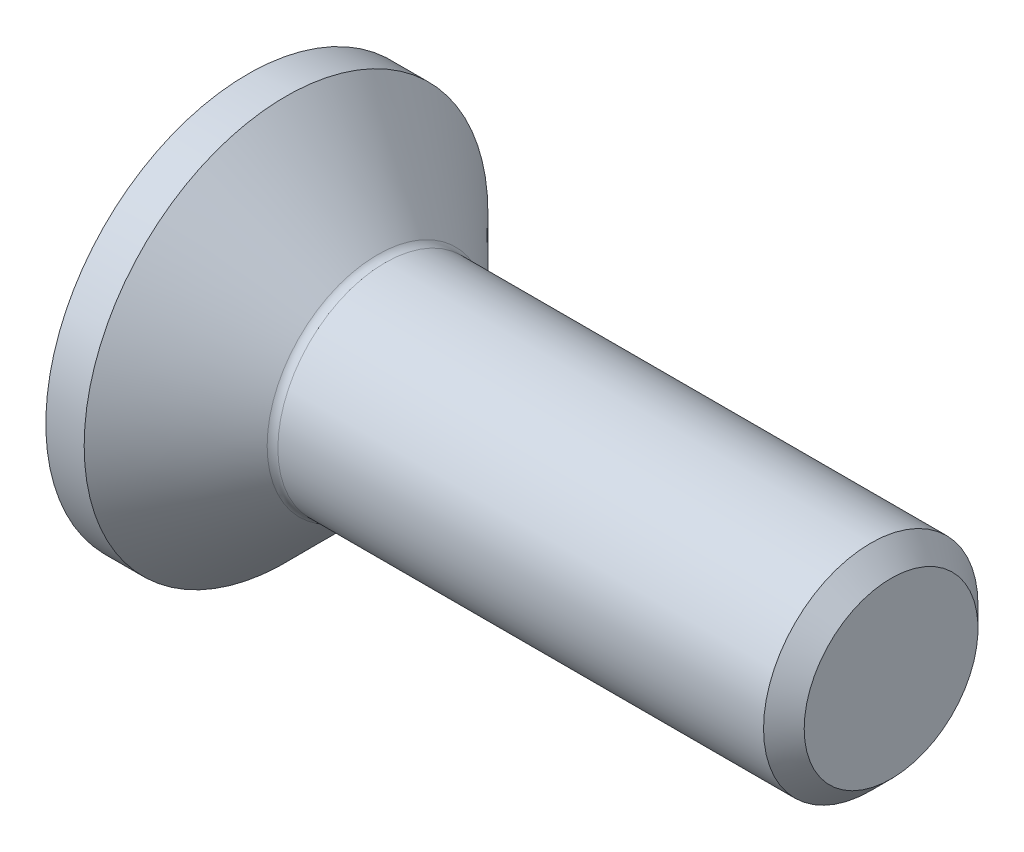
ISO-10303-21;
HEADER;
FILE_DESCRIPTION(('STEP AP214'),'2;1');
FILE_NAME('part.step','',(''),(''),'','','');
FILE_SCHEMA(('AUTOMOTIVE_DESIGN { 1 0 10303 214 1 1 1 1 }'));
ENDSEC;
DATA;
#1=APPLICATION_CONTEXT('core data for automotive mechanical design processes');
#2=APPLICATION_PROTOCOL_DEFINITION('international standard','automotive_design',2000,#1);
#3=PRODUCT_CONTEXT('',#1,'mechanical');
#4=PRODUCT('Part','Part','',(#3));
#5=PRODUCT_RELATED_PRODUCT_CATEGORY('part','',(#4));
#6=PRODUCT_DEFINITION_FORMATION('','',#4);
#7=PRODUCT_DEFINITION_CONTEXT('part definition',#1,'design');
#8=PRODUCT_DEFINITION('design','',#6,#7);
#9=PRODUCT_DEFINITION_SHAPE('','',#8);
#10=(LENGTH_UNIT() NAMED_UNIT(*) SI_UNIT(.MILLI.,.METRE.));
#11=(NAMED_UNIT(*) PLANE_ANGLE_UNIT() SI_UNIT($,.RADIAN.));
#12=(NAMED_UNIT(*) SI_UNIT($,.STERADIAN.) SOLID_ANGLE_UNIT());
#13=UNCERTAINTY_MEASURE_WITH_UNIT(LENGTH_MEASURE(1.E-05),#10,'distance_accuracy_value','');
#14=(GEOMETRIC_REPRESENTATION_CONTEXT(3) GLOBAL_UNCERTAINTY_ASSIGNED_CONTEXT((#13)) GLOBAL_UNIT_ASSIGNED_CONTEXT((#10,
#11,#12)) REPRESENTATION_CONTEXT('',''));
#15=CARTESIAN_POINT('',(0.,0.,0.));
#16=DIRECTION('',(0.,0.,1.));
#17=DIRECTION('',(1.,0.,0.));
#18=AXIS2_PLACEMENT_3D('',#15,#16,#17);
#19=CARTESIAN_POINT('',(12.,2.,0.));
#20=DIRECTION('',(-1.,0.,0.));
#21=DIRECTION('',(0.,0.,1.));
#22=AXIS2_PLACEMENT_3D('',#19,#20,#21);
#23=PLANE('',#22);
#24=CARTESIAN_POINT('',(12.,0.,0.));
#25=DIRECTION('',(-1.,0.,0.));
#26=DIRECTION('',(0.,0.,1.));
#27=AXIS2_PLACEMENT_3D('',#24,#25,#26);
#28=CIRCLE('',#27,1.62099999999999);
#29=CARTESIAN_POINT('',(12.,0.,1.62099999999999));
#30=VERTEX_POINT('',#29);
#31=EDGE_CURVE('E11',#30,#30,#28,.F.);
#32=ORIENTED_EDGE('',*,*,#31,.T.);
#33=EDGE_LOOP('',(#32));
#34=FACE_BOUND('',#33,.T.);
#35=ADVANCED_FACE('F36',(#34),#23,.F.);
#36=CARTESIAN_POINT('',(-0.587069180985524,0.,0.));
#37=DIRECTION('',(-1.,0.,0.));
#38=DIRECTION('',(0.,0.,1.));
#39=AXIS2_PLACEMENT_3D('',#36,#37,#38);
#40=CYLINDRICAL_SURFACE('',#39,2.);
#41=CARTESIAN_POINT('',(11.621,0.,0.));
#42=DIRECTION('',(-1.,0.,0.));
#43=DIRECTION('',(0.,0.,1.));
#44=AXIS2_PLACEMENT_3D('',#41,#42,#43);
#45=CIRCLE('',#44,2.);
#46=CARTESIAN_POINT('',(11.621,0.,2.));
#47=VERTEX_POINT('',#46);
#48=EDGE_CURVE('E45',#47,#47,#45,.T.);
#49=ORIENTED_EDGE('',*,*,#48,.T.);
#50=EDGE_LOOP('',(#49));
#51=FACE_BOUND('',#50,.T.);
#52=CARTESIAN_POINT('',(2.56284271247462,0.,0.));
#53=DIRECTION('',(-1.,0.,0.));
#54=DIRECTION('',(0.,0.,1.));
#55=AXIS2_PLACEMENT_3D('',#52,#53,#54);
#56=CIRCLE('',#55,2.);
#57=CARTESIAN_POINT('',(2.56284271247462,0.,2.));
#58=VERTEX_POINT('',#57);
#59=EDGE_CURVE('E149',#58,#58,#56,.F.);
#60=ORIENTED_EDGE('',*,*,#59,.T.);
#61=EDGE_LOOP('',(#60));
#62=FACE_BOUND('',#61,.T.);
#63=ADVANCED_FACE('F127',(#51,#62),#40,.T.);
#64=CARTESIAN_POINT('',(2.48,0.,0.));
#65=DIRECTION('',(-1.,0.,0.));
#66=DIRECTION('',(0.,0.,1.));
#67=AXIS2_PLACEMENT_3D('',#64,#65,#66);
#68=CONICAL_SURFACE('',#67,2.,0.785398163397448);
#69=CARTESIAN_POINT('',(0.714999999999996,0.,0.));
#70=DIRECTION('',(-1.,0.,0.));
#71=DIRECTION('',(0.,0.,1.));
#72=AXIS2_PLACEMENT_3D('',#69,#70,#71);
#73=CIRCLE('',#72,3.765);
#74=CARTESIAN_POINT('',(0.714999999999996,0.,3.765));
#75=VERTEX_POINT('',#74);
#76=EDGE_CURVE('E40',#75,#75,#73,.F.);
#77=ORIENTED_EDGE('',*,*,#76,.T.);
#78=EDGE_LOOP('',(#77));
#79=FACE_BOUND('',#78,.T.);
#80=CARTESIAN_POINT('',(2.42142135623731,0.,0.));
#81=DIRECTION('',(-1.,0.,0.));
#82=DIRECTION('',(0.,0.,1.));
#83=AXIS2_PLACEMENT_3D('',#80,#81,#82);
#84=CIRCLE('',#83,2.05857864376269);
#85=CARTESIAN_POINT('',(2.42142135623731,0.,2.05857864376269));
#86=VERTEX_POINT('',#85);
#87=EDGE_CURVE('E152',#86,#86,#84,.T.);
#88=ORIENTED_EDGE('',*,*,#87,.T.);
#89=EDGE_LOOP('',(#88));
#90=FACE_BOUND('',#89,.T.);
#91=ADVANCED_FACE('F133',(#79,#90),#68,.T.);
#92=CARTESIAN_POINT('',(2.56284271247462,0.,0.));
#93=DIRECTION('',(-1.,0.,0.));
#94=DIRECTION('',(0.,0.,1.));
#95=AXIS2_PLACEMENT_3D('',#92,#93,#94);
#96=TOROIDAL_SURFACE('',#95,2.2,0.2);
#97=ORIENTED_EDGE('',*,*,#59,.F.);
#98=EDGE_LOOP('',(#97));
#99=FACE_BOUND('',#98,.T.);
#100=ORIENTED_EDGE('',*,*,#87,.F.);
#101=EDGE_LOOP('',(#100));
#102=FACE_BOUND('',#101,.T.);
#103=ADVANCED_FACE('F137',(#99,#102),#96,.F.);
#104=CARTESIAN_POINT('',(11.621,0.,0.));
#105=DIRECTION('',(-1.,0.,0.));
#106=DIRECTION('',(0.,0.,1.));
#107=AXIS2_PLACEMENT_3D('',#104,#105,#106);
#108=CONICAL_SURFACE('',#107,2.,0.785398163397453);
#109=ORIENTED_EDGE('',*,*,#31,.F.);
#110=EDGE_LOOP('',(#109));
#111=FACE_BOUND('',#110,.T.);
#112=ORIENTED_EDGE('',*,*,#48,.F.);
#113=EDGE_LOOP('',(#112));
#114=FACE_BOUND('',#113,.T.);
#115=ADVANCED_FACE('F38',(#111,#114),#108,.T.);
#116=CARTESIAN_POINT('',(11.8531386861314,0.,0.));
#117=DIRECTION('',(1.,0.,0.));
#118=DIRECTION('',(0.,0.,-1.));
#119=AXIS2_PLACEMENT_3D('',#116,#117,#118);
#120=CYLINDRICAL_SURFACE('',#119,3.765);
#121=ORIENTED_EDGE('',*,*,#76,.F.);
#122=EDGE_LOOP('',(#121));
#123=FACE_BOUND('',#122,.T.);
#124=CARTESIAN_POINT('',(0.,0.,0.));
#125=DIRECTION('',(1.,0.,0.));
#126=DIRECTION('',(0.,0.,-1.));
#127=AXIS2_PLACEMENT_3D('',#124,#125,#126);
#128=CIRCLE('',#127,3.765);
#129=CARTESIAN_POINT('',(0.,0.,-3.765));
#130=VERTEX_POINT('',#129);
#131=EDGE_CURVE('E219',#130,#130,#128,.F.);
#132=ORIENTED_EDGE('',*,*,#131,.F.);
#133=EDGE_LOOP('',(#132));
#134=FACE_BOUND('',#133,.T.);
#135=ADVANCED_FACE('F114',(#123,#134),#120,.T.);
#136=CARTESIAN_POINT('',(2.22168783648703,0.,0.));
#137=DIRECTION('',(-1.,0.,0.));
#138=DIRECTION('',(0.,0.,1.));
#139=AXIS2_PLACEMENT_3D('',#136,#137,#138);
#140=CONICAL_SURFACE('',#139,0.,1.0471975511966);
#141=CARTESIAN_POINT('',(1.5,0.,0.));
#142=DIRECTION('',(-1.,0.,0.));
#143=DIRECTION('',(0.,0.,1.));
#144=AXIS2_PLACEMENT_3D('',#141,#142,#143);
#145=CIRCLE('',#144,1.25);
#146=CARTESIAN_POINT('',(1.5,0.625,1.08253175473055));
#147=VERTEX_POINT('',#146);
#148=CARTESIAN_POINT('',(1.5,1.25,0.));
#149=VERTEX_POINT('',#148);
#150=EDGE_CURVE('E159',#147,#149,#145,.T.);
#151=ORIENTED_EDGE('',*,*,#150,.T.);
#152=CARTESIAN_POINT('',(1.5,0.625000000000001,-1.08253175473055));
#153=VERTEX_POINT('',#152);
#154=EDGE_CURVE('E154',#149,#153,#145,.T.);
#155=ORIENTED_EDGE('',*,*,#154,.T.);
#156=CARTESIAN_POINT('',(1.5,-0.625,-1.08253175473055));
#157=VERTEX_POINT('',#156);
#158=EDGE_CURVE('E157',#153,#157,#145,.T.);
#159=ORIENTED_EDGE('',*,*,#158,.T.);
#160=CARTESIAN_POINT('',(1.5,-1.25,0.));
#161=VERTEX_POINT('',#160);
#162=EDGE_CURVE('E244',#157,#161,#145,.T.);
#163=ORIENTED_EDGE('',*,*,#162,.T.);
#164=CARTESIAN_POINT('',(1.5,-0.625,1.08253175473055));
#165=VERTEX_POINT('',#164);
#166=EDGE_CURVE('E52',#161,#165,#145,.T.);
#167=ORIENTED_EDGE('',*,*,#166,.T.);
#168=EDGE_CURVE('E168',#165,#147,#145,.T.);
#169=ORIENTED_EDGE('',*,*,#168,.T.);
#170=EDGE_LOOP('',(#151,#155,#159,#163,#167,#169));
#171=FACE_BOUND('',#170,.T.);
#172=CARTESIAN_POINT('',(2.22168783648703,0.,0.));
#173=VERTEX_POINT('',#172);
#174=VERTEX_LOOP('',#173);
#175=FACE_BOUND('',#174,.T.);
#176=ADVANCED_FACE('F111',(#171,#175),#140,.F.);
#177=CARTESIAN_POINT('',(1.5,0.,-1.44337567297407));
#178=DIRECTION('',(1.,0.,0.));
#179=DIRECTION('',(0.,0.,-1.));
#180=AXIS2_PLACEMENT_3D('',#177,#178,#179);
#181=PLANE('',#180);
#182=ORIENTED_EDGE('',*,*,#166,.F.);
#183=DIRECTION('',(0.,0.,-1.));
#184=VECTOR('',#183,1.);
#185=CARTESIAN_POINT('',(1.5,-1.25,0.721687836487032));
#186=LINE('',#185,#184);
#187=CARTESIAN_POINT('',(1.5,-1.25,0.721687836487032));
#188=VERTEX_POINT('',#187);
#189=EDGE_CURVE('E179',#188,#161,#186,.T.);
#190=ORIENTED_EDGE('',*,*,#189,.F.);
#191=DIRECTION('',(0.,-0.866025403784438,-0.5));
#192=VECTOR('',#191,1.);
#193=CARTESIAN_POINT('',(1.5,0.,1.44337567297406));
#194=LINE('',#193,#192);
#195=EDGE_CURVE('E203',#165,#188,#194,.T.);
#196=ORIENTED_EDGE('',*,*,#195,.F.);
#197=EDGE_LOOP('',(#182,#190,#196));
#198=FACE_BOUND('',#197,.T.);
#199=ADVANCED_FACE('F113',(#198),#181,.F.);
#200=ORIENTED_EDGE('',*,*,#168,.F.);
#201=CARTESIAN_POINT('',(1.5,0.,1.44337567297406));
#202=VERTEX_POINT('',#201);
#203=EDGE_CURVE('E200',#202,#165,#194,.T.);
#204=ORIENTED_EDGE('',*,*,#203,.F.);
#205=DIRECTION('',(0.,-0.866025403784439,0.5));
#206=VECTOR('',#205,1.);
#207=CARTESIAN_POINT('',(1.5,1.25,0.721687836487032));
#208=LINE('',#207,#206);
#209=EDGE_CURVE('E207',#147,#202,#208,.T.);
#210=ORIENTED_EDGE('',*,*,#209,.F.);
#211=EDGE_LOOP('',(#200,#204,#210));
#212=FACE_BOUND('',#211,.T.);
#213=ADVANCED_FACE('F120',(#212),#181,.F.);
#214=ORIENTED_EDGE('',*,*,#150,.F.);
#215=CARTESIAN_POINT('',(1.5,1.25,0.721687836487032));
#216=VERTEX_POINT('',#215);
#217=EDGE_CURVE('E204',#216,#147,#208,.T.);
#218=ORIENTED_EDGE('',*,*,#217,.F.);
#219=DIRECTION('',(0.,0.,1.));
#220=VECTOR('',#219,1.);
#221=CARTESIAN_POINT('',(1.5,1.25,-0.721687836487032));
#222=LINE('',#221,#220);
#223=EDGE_CURVE('E211',#149,#216,#222,.T.);
#224=ORIENTED_EDGE('',*,*,#223,.F.);
#225=EDGE_LOOP('',(#214,#218,#224));
#226=FACE_BOUND('',#225,.T.);
#227=ADVANCED_FACE('F275',(#226),#181,.F.);
#228=ORIENTED_EDGE('',*,*,#154,.F.);
#229=CARTESIAN_POINT('',(1.5,1.25,-0.721687836487032));
#230=VERTEX_POINT('',#229);
#231=EDGE_CURVE('E208',#230,#149,#222,.T.);
#232=ORIENTED_EDGE('',*,*,#231,.F.);
#233=DIRECTION('',(0.,0.866025403784438,0.5));
#234=VECTOR('',#233,1.);
#235=CARTESIAN_POINT('',(1.5,0.,-1.44337567297407));
#236=LINE('',#235,#234);
#237=EDGE_CURVE('E215',#153,#230,#236,.T.);
#238=ORIENTED_EDGE('',*,*,#237,.F.);
#239=EDGE_LOOP('',(#228,#232,#238));
#240=FACE_BOUND('',#239,.T.);
#241=ADVANCED_FACE('F280',(#240),#181,.F.);
#242=ORIENTED_EDGE('',*,*,#158,.F.);
#243=CARTESIAN_POINT('',(1.5,0.,-1.44337567297407));
#244=VERTEX_POINT('',#243);
#245=EDGE_CURVE('E212',#244,#153,#236,.T.);
#246=ORIENTED_EDGE('',*,*,#245,.F.);
#247=DIRECTION('',(0.,0.866025403784439,-0.5));
#248=VECTOR('',#247,1.);
#249=CARTESIAN_POINT('',(1.5,-1.25,-0.721687836487033));
#250=LINE('',#249,#248);
#251=EDGE_CURVE('E183',#157,#244,#250,.T.);
#252=ORIENTED_EDGE('',*,*,#251,.F.);
#253=EDGE_LOOP('',(#242,#246,#252));
#254=FACE_BOUND('',#253,.T.);
#255=ADVANCED_FACE('F249',(#254),#181,.F.);
#256=ORIENTED_EDGE('',*,*,#162,.F.);
#257=CARTESIAN_POINT('',(1.5,-1.25,-0.721687836487033));
#258=VERTEX_POINT('',#257);
#259=EDGE_CURVE('E216',#258,#157,#250,.T.);
#260=ORIENTED_EDGE('',*,*,#259,.F.);
#261=EDGE_CURVE('E199',#161,#258,#186,.T.);
#262=ORIENTED_EDGE('',*,*,#261,.F.);
#263=EDGE_LOOP('',(#256,#260,#262));
#264=FACE_BOUND('',#263,.T.);
#265=ADVANCED_FACE('F123',(#264),#181,.F.);
#266=CARTESIAN_POINT('',(1.5,-1.25,0.721687836487032));
#267=DIRECTION('',(0.,1.,0.));
#268=DIRECTION('',(0.,0.,1.));
#269=AXIS2_PLACEMENT_3D('',#266,#267,#268);
#270=PLANE('',#269);
#271=DIRECTION('',(0.,0.,-1.));
#272=VECTOR('',#271,1.);
#273=CARTESIAN_POINT('',(0.,-1.25,0.721687836487032));
#274=LINE('',#273,#272);
#275=CARTESIAN_POINT('',(0.,-1.25,0.721687836487032));
#276=VERTEX_POINT('',#275);
#277=CARTESIAN_POINT('',(0.,-1.25,-0.721687836487033));
#278=VERTEX_POINT('',#277);
#279=EDGE_CURVE('E180',#276,#278,#274,.T.);
#280=ORIENTED_EDGE('',*,*,#279,.F.);
#281=DIRECTION('',(-1.,0.,0.));
#282=VECTOR('',#281,1.);
#283=CARTESIAN_POINT('',(1.5,-1.25,0.721687836487032));
#284=LINE('',#283,#282);
#285=EDGE_CURVE('E175',#188,#276,#284,.T.);
#286=ORIENTED_EDGE('',*,*,#285,.F.);
#287=ORIENTED_EDGE('',*,*,#189,.T.);
#288=ORIENTED_EDGE('',*,*,#261,.T.);
#289=DIRECTION('',(-1.,0.,0.));
#290=VECTOR('',#289,1.);
#291=CARTESIAN_POINT('',(1.5,-1.25,-0.721687836487033));
#292=LINE('',#291,#290);
#293=EDGE_CURVE('E177',#258,#278,#292,.T.);
#294=ORIENTED_EDGE('',*,*,#293,.T.);
#295=EDGE_LOOP('',(#280,#286,#287,#288,#294));
#296=FACE_BOUND('',#295,.T.);
#297=ADVANCED_FACE('F238',(#296),#270,.T.);
#298=CARTESIAN_POINT('',(1.5,0.,1.44337567297406));
#299=DIRECTION('',(0.,0.5,-0.866025403784438));
#300=DIRECTION('',(0.,0.866025403784439,0.5));
#301=AXIS2_PLACEMENT_3D('',#298,#299,#300);
#302=PLANE('',#301);
#303=DIRECTION('',(0.,-0.866025403784438,-0.5));
#304=VECTOR('',#303,1.);
#305=CARTESIAN_POINT('',(0.,0.,1.44337567297406));
#306=LINE('',#305,#304);
#307=CARTESIAN_POINT('',(0.,0.,1.44337567297406));
#308=VERTEX_POINT('',#307);
#309=EDGE_CURVE('E184',#308,#276,#306,.T.);
#310=ORIENTED_EDGE('',*,*,#309,.F.);
#311=DIRECTION('',(-1.,0.,0.));
#312=VECTOR('',#311,1.);
#313=CARTESIAN_POINT('',(1.5,0.,1.44337567297406));
#314=LINE('',#313,#312);
#315=EDGE_CURVE('E173',#202,#308,#314,.T.);
#316=ORIENTED_EDGE('',*,*,#315,.F.);
#317=ORIENTED_EDGE('',*,*,#203,.T.);
#318=ORIENTED_EDGE('',*,*,#195,.T.);
#319=ORIENTED_EDGE('',*,*,#285,.T.);
#320=EDGE_LOOP('',(#310,#316,#317,#318,#319));
#321=FACE_BOUND('',#320,.T.);
#322=ADVANCED_FACE('F268',(#321),#302,.T.);
#323=CARTESIAN_POINT('',(1.5,1.25,0.721687836487032));
#324=DIRECTION('',(0.,-0.5,-0.866025403784438));
#325=DIRECTION('',(0.,0.866025403784439,-0.5));
#326=AXIS2_PLACEMENT_3D('',#323,#324,#325);
#327=PLANE('',#326);
#328=DIRECTION('',(0.,-0.866025403784439,0.5));
#329=VECTOR('',#328,1.);
#330=CARTESIAN_POINT('',(0.,1.25,0.721687836487032));
#331=LINE('',#330,#329);
#332=CARTESIAN_POINT('',(0.,1.25,0.721687836487032));
#333=VERTEX_POINT('',#332);
#334=EDGE_CURVE('E187',#333,#308,#331,.T.);
#335=ORIENTED_EDGE('',*,*,#334,.F.);
#336=DIRECTION('',(-1.,0.,0.));
#337=VECTOR('',#336,1.);
#338=CARTESIAN_POINT('',(1.5,1.25,0.721687836487032));
#339=LINE('',#338,#337);
#340=EDGE_CURVE('E171',#216,#333,#339,.T.);
#341=ORIENTED_EDGE('',*,*,#340,.F.);
#342=ORIENTED_EDGE('',*,*,#217,.T.);
#343=ORIENTED_EDGE('',*,*,#209,.T.);
#344=ORIENTED_EDGE('',*,*,#315,.T.);
#345=EDGE_LOOP('',(#335,#341,#342,#343,#344));
#346=FACE_BOUND('',#345,.T.);
#347=ADVANCED_FACE('F262',(#346),#327,.T.);
#348=CARTESIAN_POINT('',(1.5,1.25,-0.721687836487032));
#349=DIRECTION('',(0.,-1.,0.));
#350=DIRECTION('',(0.,0.,-1.));
#351=AXIS2_PLACEMENT_3D('',#348,#349,#350);
#352=PLANE('',#351);
#353=DIRECTION('',(0.,0.,1.));
#354=VECTOR('',#353,1.);
#355=CARTESIAN_POINT('',(0.,1.25,-0.721687836487032));
#356=LINE('',#355,#354);
#357=CARTESIAN_POINT('',(0.,1.25,-0.721687836487032));
#358=VERTEX_POINT('',#357);
#359=EDGE_CURVE('E190',#358,#333,#356,.T.);
#360=ORIENTED_EDGE('',*,*,#359,.F.);
#361=DIRECTION('',(-1.,0.,0.));
#362=VECTOR('',#361,1.);
#363=CARTESIAN_POINT('',(1.5,1.25,-0.721687836487032));
#364=LINE('',#363,#362);
#365=EDGE_CURVE('E169',#230,#358,#364,.T.);
#366=ORIENTED_EDGE('',*,*,#365,.F.);
#367=ORIENTED_EDGE('',*,*,#231,.T.);
#368=ORIENTED_EDGE('',*,*,#223,.T.);
#369=ORIENTED_EDGE('',*,*,#340,.T.);
#370=EDGE_LOOP('',(#360,#366,#367,#368,#369));
#371=FACE_BOUND('',#370,.T.);
#372=ADVANCED_FACE('F258',(#371),#352,.T.);
#373=CARTESIAN_POINT('',(1.5,0.,-1.44337567297407));
#374=DIRECTION('',(0.,-0.5,0.866025403784438));
#375=DIRECTION('',(0.,-0.866025403784438,-0.5));
#376=AXIS2_PLACEMENT_3D('',#373,#374,#375);
#377=PLANE('',#376);
#378=DIRECTION('',(0.,0.866025403784438,0.5));
#379=VECTOR('',#378,1.);
#380=CARTESIAN_POINT('',(0.,0.,-1.44337567297407));
#381=LINE('',#380,#379);
#382=CARTESIAN_POINT('',(0.,0.,-1.44337567297407));
#383=VERTEX_POINT('',#382);
#384=EDGE_CURVE('E193',#383,#358,#381,.T.);
#385=ORIENTED_EDGE('',*,*,#384,.F.);
#386=DIRECTION('',(-1.,0.,0.));
#387=VECTOR('',#386,1.);
#388=CARTESIAN_POINT('',(1.5,0.,-1.44337567297407));
#389=LINE('',#388,#387);
#390=EDGE_CURVE('E161',#244,#383,#389,.T.);
#391=ORIENTED_EDGE('',*,*,#390,.F.);
#392=ORIENTED_EDGE('',*,*,#245,.T.);
#393=ORIENTED_EDGE('',*,*,#237,.T.);
#394=ORIENTED_EDGE('',*,*,#365,.T.);
#395=EDGE_LOOP('',(#385,#391,#392,#393,#394));
#396=FACE_BOUND('',#395,.T.);
#397=ADVANCED_FACE('F253',(#396),#377,.T.);
#398=CARTESIAN_POINT('',(1.5,-1.25,-0.721687836487033));
#399=DIRECTION('',(0.,0.5,0.866025403784438));
#400=DIRECTION('',(0.,-0.866025403784439,0.5));
#401=AXIS2_PLACEMENT_3D('',#398,#399,#400);
#402=PLANE('',#401);
#403=DIRECTION('',(0.,0.866025403784439,-0.5));
#404=VECTOR('',#403,1.);
#405=CARTESIAN_POINT('',(0.,-1.25,-0.721687836487033));
#406=LINE('',#405,#404);
#407=EDGE_CURVE('E60',#278,#383,#406,.T.);
#408=ORIENTED_EDGE('',*,*,#407,.F.);
#409=ORIENTED_EDGE('',*,*,#293,.F.);
#410=ORIENTED_EDGE('',*,*,#259,.T.);
#411=ORIENTED_EDGE('',*,*,#251,.T.);
#412=ORIENTED_EDGE('',*,*,#390,.T.);
#413=EDGE_LOOP('',(#408,#409,#410,#411,#412));
#414=FACE_BOUND('',#413,.T.);
#415=ADVANCED_FACE('F232',(#414),#402,.T.);
#416=CARTESIAN_POINT('',(0.,0.,0.));
#417=DIRECTION('',(1.,0.,0.));
#418=DIRECTION('',(0.,0.,-1.));
#419=AXIS2_PLACEMENT_3D('',#416,#417,#418);
#420=PLANE('',#419);
#421=ORIENTED_EDGE('',*,*,#131,.T.);
#422=EDGE_LOOP('',(#421));
#423=FACE_BOUND('',#422,.T.);
#424=ORIENTED_EDGE('',*,*,#407,.T.);
#425=ORIENTED_EDGE('',*,*,#384,.T.);
#426=ORIENTED_EDGE('',*,*,#359,.T.);
#427=ORIENTED_EDGE('',*,*,#334,.T.);
#428=ORIENTED_EDGE('',*,*,#309,.T.);
#429=ORIENTED_EDGE('',*,*,#279,.T.);
#430=EDGE_LOOP('',(#424,#425,#426,#427,#428,#429));
#431=FACE_BOUND('',#430,.T.);
#432=ADVANCED_FACE('F229',(#423,#431),#420,.F.);
#433=CLOSED_SHELL('',(#35,#63,#91,#103,#115,#135,#176,#199,#213,#227,#241,#255,#265,#297,#322,
#347,#372,#397,#415,#432));
#434=MANIFOLD_SOLID_BREP('B2',#433);
#435=ADVANCED_BREP_SHAPE_REPRESENTATION('',(#18,#434),#14);
#436=SHAPE_DEFINITION_REPRESENTATION(#9,#435);
ENDSEC;
END-ISO-10303-21;
